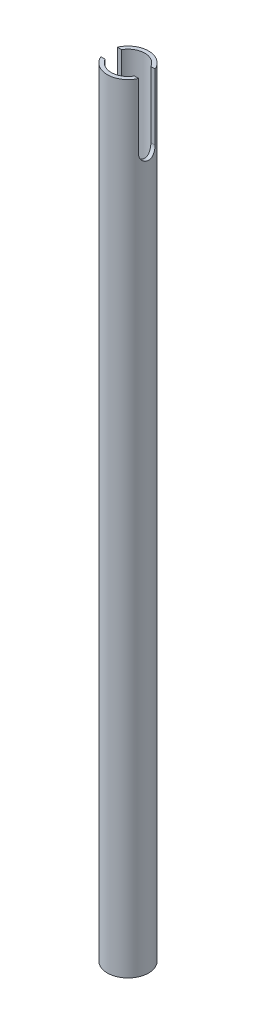
ISO-10303-21;
HEADER;
FILE_DESCRIPTION(('STEP AP214'),'2;1');
FILE_NAME('part.step','',(''),(''),'','','');
FILE_SCHEMA(('AUTOMOTIVE_DESIGN { 1 0 10303 214 1 1 1 1 }'));
ENDSEC;
DATA;
#1=APPLICATION_CONTEXT('core data for automotive mechanical design processes');
#2=APPLICATION_PROTOCOL_DEFINITION('international standard','automotive_design',2000,#1);
#3=PRODUCT_CONTEXT('',#1,'mechanical');
#4=PRODUCT('Part','Part','',(#3));
#5=PRODUCT_RELATED_PRODUCT_CATEGORY('part','',(#4));
#6=PRODUCT_DEFINITION_FORMATION('','',#4);
#7=PRODUCT_DEFINITION_CONTEXT('part definition',#1,'design');
#8=PRODUCT_DEFINITION('design','',#6,#7);
#9=PRODUCT_DEFINITION_SHAPE('','',#8);
#10=(LENGTH_UNIT() NAMED_UNIT(*) SI_UNIT(.MILLI.,.METRE.));
#11=(NAMED_UNIT(*) PLANE_ANGLE_UNIT() SI_UNIT($,.RADIAN.));
#12=(NAMED_UNIT(*) SI_UNIT($,.STERADIAN.) SOLID_ANGLE_UNIT());
#13=UNCERTAINTY_MEASURE_WITH_UNIT(LENGTH_MEASURE(1.E-05),#10,'distance_accuracy_value','');
#14=(GEOMETRIC_REPRESENTATION_CONTEXT(3) GLOBAL_UNCERTAINTY_ASSIGNED_CONTEXT((#13)) GLOBAL_UNIT_ASSIGNED_CONTEXT((#10,
#11,#12)) REPRESENTATION_CONTEXT('',''));
#15=CARTESIAN_POINT('',(0.,0.,0.));
#16=DIRECTION('',(0.,0.,1.));
#17=DIRECTION('',(1.,0.,0.));
#18=AXIS2_PLACEMENT_3D('',#15,#16,#17);
#19=CARTESIAN_POINT('',(0.,347.675648343785,0.));
#20=DIRECTION('',(0.,-1.,0.));
#21=DIRECTION('',(0.,0.,-1.));
#22=AXIS2_PLACEMENT_3D('',#19,#20,#21);
#23=CYLINDRICAL_SURFACE('',#22,7.9375);
#24=CARTESIAN_POINT('',(0.,0.,0.));
#25=DIRECTION('',(0.,1.,0.));
#26=DIRECTION('',(0.,0.,1.));
#27=AXIS2_PLACEMENT_3D('',#24,#25,#26);
#28=CIRCLE('',#27,7.9375);
#29=CARTESIAN_POINT('',(0.,0.,7.9375));
#30=VERTEX_POINT('',#29);
#31=EDGE_CURVE('E197',#30,#30,#28,.T.);
#32=ORIENTED_EDGE('',*,*,#31,.T.);
#33=EDGE_LOOP('',(#32));
#34=FACE_BOUND('',#33,.T.);
#35=DIRECTION('',(0.,-1.,0.));
#36=VECTOR('',#35,1.);
#37=CARTESIAN_POINT('',(-7.2748389157424,347.675648343785,3.175));
#38=LINE('',#37,#36);
#39=CARTESIAN_POINT('',(-7.27483891574239,274.425008041112,3.175));
#40=VERTEX_POINT('',#39);
#41=CARTESIAN_POINT('',(-7.27483891574239,299.825008041112,3.175));
#42=VERTEX_POINT('',#41);
#43=EDGE_CURVE('E143',#40,#42,#38,.F.);
#44=ORIENTED_EDGE('',*,*,#43,.F.);
#45=CARTESIAN_POINT('',(-7.27483891574239,274.425008041112,-3.175));
#46=CARTESIAN_POINT('',(-7.2748213734673,274.339591250264,-3.17501266882702));
#47=CARTESIAN_POINT('',(-7.2763428589775,274.254184047039,-3.17155340043565));
#48=CARTESIAN_POINT('',(-7.2823328035035,274.084058605132,-3.15779000732847));
#49=CARTESIAN_POINT('',(-7.28680014012065,273.999340116484,-3.14748848956709));
#50=CARTESIAN_POINT('',(-7.29852780386515,273.831526211887,-3.12019320836238));
#51=CARTESIAN_POINT('',(-7.30577708764083,273.748425726442,-3.10322589952439));
#52=CARTESIAN_POINT('',(-7.32282084608483,273.584108066015,-3.06278962927675));
#53=CARTESIAN_POINT('',(-7.3326154761132,273.502891006322,-3.03932027099635));
#54=CARTESIAN_POINT('',(-7.36535374856867,273.263059878313,-2.95952817722213));
#55=CARTESIAN_POINT('',(-7.39167700537415,273.107931949893,-2.89376627017735));
#56=CARTESIAN_POINT('',(-7.45033388590045,272.810845057729,-2.73920254152611));
#57=CARTESIAN_POINT('',(-7.48267321509131,272.66889878828,-2.65037881684982));
#58=CARTESIAN_POINT('',(-7.55175336550834,272.394178986397,-2.4468428923214));
#59=CARTESIAN_POINT('',(-7.58863489946299,272.262250084272,-2.33103600963011));
#60=CARTESIAN_POINT('',(-7.66147804996073,272.019087858956,-2.07914313305183));
#61=CARTESIAN_POINT('',(-7.69743947634239,271.907858784533,-1.94305298619928));
#62=CARTESIAN_POINT('',(-7.76610424655587,271.704975390409,-1.64783437907488));
#63=CARTESIAN_POINT('',(-7.79862271461643,271.614268156722,-1.48800809365191));
#64=CARTESIAN_POINT('',(-7.85501261299655,271.461393075406,-1.15383332747063));
#65=CARTESIAN_POINT('',(-7.87888765130921,271.39921331676,-0.979490943577494));
#66=CARTESIAN_POINT('',(-7.91429574508624,271.308203885144,-0.630185812820628));
#67=CARTESIAN_POINT('',(-7.92637039529115,271.27790526061,-0.455661798193253));
#68=CARTESIAN_POINT('',(-7.93877492459936,271.246787825139,-0.103613634211555));
#69=CARTESIAN_POINT('',(-7.93910896442721,271.245958570626,0.0739094300030672));
#70=CARTESIAN_POINT('',(-7.92832361516669,271.272999562552,0.416295487790186));
#71=CARTESIAN_POINT('',(-7.91784651916131,271.299260354581,0.581309494992126));
#72=CARTESIAN_POINT('',(-7.88748217026596,271.376997554682,0.90435871255696));
#73=CARTESIAN_POINT('',(-7.86759438481231,271.428475389825,1.06239352740443));
#74=CARTESIAN_POINT('',(-7.81997467816327,271.55581835784,1.36984988491622));
#75=CARTESIAN_POINT('',(-7.7921290207194,271.632039447975,1.51910565802054));
#76=CARTESIAN_POINT('',(-7.73135683541739,271.806369838171,1.80309420082015));
#77=CARTESIAN_POINT('',(-7.69842852631223,271.904486817178,1.93782185081833));
#78=CARTESIAN_POINT('',(-7.62828318752464,272.127333611424,2.19831250886755));
#79=CARTESIAN_POINT('',(-7.59092651959626,272.253386753899,2.32290812422053));
#80=CARTESIAN_POINT('',(-7.51779639956166,272.524727652491,2.5496801795791));
#81=CARTESIAN_POINT('',(-7.48202367463434,272.670024123407,2.6518464058569));
#82=CARTESIAN_POINT('',(-7.41514238501918,272.981173063146,2.83359604410577));
#83=CARTESIAN_POINT('',(-7.38419755733311,273.147496554611,2.9124454400729));
#84=CARTESIAN_POINT('',(-7.34535742834898,273.406037427998,3.00845526999255));
#85=CARTESIAN_POINT('',(-7.33367552004289,273.493704236221,3.03674359852998));
#86=CARTESIAN_POINT('',(-7.31322917691504,273.671469950935,3.08565852812916));
#87=CARTESIAN_POINT('',(-7.30446343423192,273.761567747505,3.10628856431505));
#88=CARTESIAN_POINT('',(-7.28994070197193,273.946732199543,3.14023004946565));
#89=CARTESIAN_POINT('',(-7.2843027635288,274.041861225068,3.15325280299648));
#90=CARTESIAN_POINT('',(-7.27673901487912,274.232991799659,3.17064531592314));
#91=CARTESIAN_POINT('',(-7.2748109173123,274.328992774399,3.17502040721544));
#92=CARTESIAN_POINT('',(-7.2748389157424,274.425008041112,3.175));
#93=B_SPLINE_CURVE_WITH_KNOTS('',3,(#45,#46,#47,#48,#49,#50,#51,#52,#53,#54,#55,#56,#57,#58,#59,
#60,#61,#62,#63,#64,#65,#66,#67,#68,#69,#70,#71,#72,#73,#74,#75,#76,#77,#78,#79,#80,#81,#82,#83,
#84,#85,#86,#87,#88,#89,#90,#91,#92),.UNSPECIFIED.,.F.,.F.,(4,2,2,2,2,2,2,2,2,2,2,2,2,2,2,2,2,2,
2,2,2,2,2,4),(0.,0.256150829294387,0.512204118914552,0.767251309112325,1.02231407025902,
1.53143426526075,2.04103977971416,2.57679901192849,3.11266809105968,3.6697103854465,
4.22651988700748,4.75637028950526,5.28603291779514,5.7859440297451,6.28588343572724,
6.79335980872481,7.30101443548666,7.8419622604596,8.383155909604,8.93991483457339,
9.21815697205885,9.49627415290111,9.78435582473146,10.072259818324),.UNSPECIFIED.);
#94=CARTESIAN_POINT('',(-7.27483891574239,274.425008041112,-3.175));
#95=VERTEX_POINT('',#94);
#96=EDGE_CURVE('E118',#95,#40,#93,.T.);
#97=ORIENTED_EDGE('',*,*,#96,.F.);
#98=DIRECTION('',(0.,-1.,0.));
#99=VECTOR('',#98,1.);
#100=CARTESIAN_POINT('',(-7.2748389157424,347.675648343785,-3.17499999999999));
#101=LINE('',#100,#99);
#102=CARTESIAN_POINT('',(-7.27483891574239,299.825008041112,-3.175));
#103=VERTEX_POINT('',#102);
#104=EDGE_CURVE('E131',#103,#95,#101,.T.);
#105=ORIENTED_EDGE('',*,*,#104,.F.);
#106=CARTESIAN_POINT('',(0.,299.825008041112,0.));
#107=DIRECTION('',(0.,1.,0.));
#108=DIRECTION('',(-1.,0.,0.));
#109=AXIS2_PLACEMENT_3D('',#106,#107,#108);
#110=CIRCLE('',#109,7.9375);
#111=CARTESIAN_POINT('',(7.2748389157424,299.825008041112,-3.175));
#112=VERTEX_POINT('',#111);
#113=EDGE_CURVE('E130',#112,#103,#110,.T.);
#114=ORIENTED_EDGE('',*,*,#113,.F.);
#115=DIRECTION('',(0.,-1.,0.));
#116=VECTOR('',#115,1.);
#117=CARTESIAN_POINT('',(7.2748389157424,347.675648343785,-3.17499999999999));
#118=LINE('',#117,#116);
#119=CARTESIAN_POINT('',(7.2748389157424,274.425008041112,-3.175));
#120=VERTEX_POINT('',#119);
#121=EDGE_CURVE('E56',#120,#112,#118,.F.);
#122=ORIENTED_EDGE('',*,*,#121,.F.);
#123=CARTESIAN_POINT('',(7.2748389157424,274.425008041112,3.175));
#124=CARTESIAN_POINT('',(7.2748213734673,274.339591250264,3.17501266882701));
#125=CARTESIAN_POINT('',(7.2763428589775,274.254184047039,3.17155340043564));
#126=CARTESIAN_POINT('',(7.2823328035035,274.084058605132,3.15779000732846));
#127=CARTESIAN_POINT('',(7.28680014012065,273.999340116484,3.14748848956708));
#128=CARTESIAN_POINT('',(7.29852780386515,273.831526211887,3.12019320836237));
#129=CARTESIAN_POINT('',(7.30577708764083,273.748425726442,3.10322589952439));
#130=CARTESIAN_POINT('',(7.32282084608483,273.584108066015,3.06278962927675));
#131=CARTESIAN_POINT('',(7.3326154761132,273.502891006322,3.03932027099634));
#132=CARTESIAN_POINT('',(7.36535374856867,273.263059878313,2.95952817722213));
#133=CARTESIAN_POINT('',(7.39167700537415,273.107931949893,2.89376627017734));
#134=CARTESIAN_POINT('',(7.45033388590046,272.810845057729,2.7392025415261));
#135=CARTESIAN_POINT('',(7.48267321509131,272.66889878828,2.65037881684982));
#136=CARTESIAN_POINT('',(7.55175336550835,272.394178986397,2.4468428923214));
#137=CARTESIAN_POINT('',(7.588634899463,272.262250084272,2.3310360096301));
#138=CARTESIAN_POINT('',(7.66147804996073,272.019087858956,2.07914313305183));
#139=CARTESIAN_POINT('',(7.69743947634238,271.907858784533,1.94305298619927));
#140=CARTESIAN_POINT('',(7.76610424655587,271.704975390409,1.64783437907488));
#141=CARTESIAN_POINT('',(7.79862271461643,271.614268156722,1.48800809365191));
#142=CARTESIAN_POINT('',(7.85501261299655,271.461393075406,1.15383332747062));
#143=CARTESIAN_POINT('',(7.87888765130921,271.39921331676,0.97949094357749));
#144=CARTESIAN_POINT('',(7.91429574508624,271.308203885144,0.630185812820622));
#145=CARTESIAN_POINT('',(7.92637039529115,271.27790526061,0.455661798193245));
#146=CARTESIAN_POINT('',(7.93877492459936,271.246787825139,0.103613634211547));
#147=CARTESIAN_POINT('',(7.93910896442721,271.245958570626,-0.0739094300030729));
#148=CARTESIAN_POINT('',(7.92832361516669,271.272999562552,-0.416295487790189));
#149=CARTESIAN_POINT('',(7.91784651916131,271.299260354581,-0.581309494992129));
#150=CARTESIAN_POINT('',(7.88748217026596,271.376997554682,-0.904358712556963));
#151=CARTESIAN_POINT('',(7.86759438481231,271.428475389825,-1.06239352740444));
#152=CARTESIAN_POINT('',(7.81997467816327,271.55581835784,-1.36984988491622));
#153=CARTESIAN_POINT('',(7.7921290207194,271.632039447975,-1.51910565802055));
#154=CARTESIAN_POINT('',(7.73135683541739,271.806369838171,-1.80309420082015));
#155=CARTESIAN_POINT('',(7.69842852631223,271.904486817178,-1.93782185081833));
#156=CARTESIAN_POINT('',(7.62828318752464,272.127333611424,-2.19831250886756));
#157=CARTESIAN_POINT('',(7.59092651959626,272.253386753899,-2.32290812422054));
#158=CARTESIAN_POINT('',(7.51779639956165,272.524727652491,-2.54968017957911));
#159=CARTESIAN_POINT('',(7.48202367463434,272.670024123407,-2.65184640585691));
#160=CARTESIAN_POINT('',(7.41514238501918,272.981173063146,-2.83359604410578));
#161=CARTESIAN_POINT('',(7.38419755733311,273.147496554611,-2.91244544007291));
#162=CARTESIAN_POINT('',(7.34535742834898,273.406037427998,-3.00845526999255));
#163=CARTESIAN_POINT('',(7.3336755200429,273.493704236221,-3.03674359852997));
#164=CARTESIAN_POINT('',(7.31322917691504,273.671469950935,-3.08565852812915));
#165=CARTESIAN_POINT('',(7.30446343423192,273.761567747505,-3.10628856431505));
#166=CARTESIAN_POINT('',(7.28994070197193,273.946732199543,-3.14023004946565));
#167=CARTESIAN_POINT('',(7.2843027635288,274.041861225068,-3.15325280299648));
#168=CARTESIAN_POINT('',(7.27673901487912,274.232991799659,-3.17064531592315));
#169=CARTESIAN_POINT('',(7.2748109173123,274.328992774399,-3.17502040721544));
#170=CARTESIAN_POINT('',(7.27483891574239,274.425008041112,-3.175));
#171=B_SPLINE_CURVE_WITH_KNOTS('',3,(#123,#124,#125,#126,#127,#128,#129,#130,#131,#132,#133,
#134,#135,#136,#137,#138,#139,#140,#141,#142,#143,#144,#145,#146,#147,#148,#149,#150,#151,#152,
#153,#154,#155,#156,#157,#158,#159,#160,#161,#162,#163,#164,#165,#166,#167,#168,#169,#170),
.UNSPECIFIED.,.F.,.F.,(4,2,2,2,2,2,2,2,2,2,2,2,2,2,2,2,2,2,2,2,2,2,2,4),(0.,0.256150829294386,
0.512204118914552,0.767251309112325,1.02231407025902,1.53143426526075,2.04103977971416,
2.57679901192849,3.11266809105968,3.6697103854465,4.22651988700748,4.75637028950527,
5.28603291779514,5.7859440297451,6.28588343572724,6.79335980872481,7.30101443548666,
7.8419622604596,8.383155909604,8.9399148345734,9.21815697205879,9.49627415290111,
9.78435582473147,10.072259818324),.UNSPECIFIED.);
#172=CARTESIAN_POINT('',(7.2748389157424,274.425008041112,3.175));
#173=VERTEX_POINT('',#172);
#174=EDGE_CURVE('E109',#173,#120,#171,.T.);
#175=ORIENTED_EDGE('',*,*,#174,.F.);
#176=DIRECTION('',(0.,-1.,0.));
#177=VECTOR('',#176,1.);
#178=CARTESIAN_POINT('',(7.2748389157424,347.675648343785,3.175));
#179=LINE('',#178,#177);
#180=CARTESIAN_POINT('',(7.2748389157424,299.825008041112,3.175));
#181=VERTEX_POINT('',#180);
#182=EDGE_CURVE('E145',#181,#173,#179,.T.);
#183=ORIENTED_EDGE('',*,*,#182,.F.);
#184=EDGE_CURVE('E200',#42,#181,#110,.T.);
#185=ORIENTED_EDGE('',*,*,#184,.F.);
#186=EDGE_LOOP('',(#44,#97,#105,#114,#122,#175,#183,#185));
#187=FACE_BOUND('',#186,.T.);
#188=ADVANCED_FACE('F35',(#34,#187),#23,.T.);
#189=CARTESIAN_POINT('',(0.,347.675648343785,0.));
#190=DIRECTION('',(0.,-1.,0.));
#191=DIRECTION('',(0.,0.,-1.));
#192=AXIS2_PLACEMENT_3D('',#189,#190,#191);
#193=CYLINDRICAL_SURFACE('',#192,6.4643);
#194=CARTESIAN_POINT('',(0.,0.,0.));
#195=DIRECTION('',(0.,1.,0.));
#196=DIRECTION('',(0.,0.,1.));
#197=AXIS2_PLACEMENT_3D('',#194,#195,#196);
#198=CIRCLE('',#197,6.4643);
#199=CARTESIAN_POINT('',(0.,0.,6.4643));
#200=VERTEX_POINT('',#199);
#201=EDGE_CURVE('E198',#200,#200,#198,.T.);
#202=ORIENTED_EDGE('',*,*,#201,.F.);
#203=EDGE_LOOP('',(#202));
#204=FACE_BOUND('',#203,.T.);
#205=CARTESIAN_POINT('',(-5.63085690548072,274.425008041112,-3.175));
#206=CARTESIAN_POINT('',(-5.63083314427865,274.341634696481,-3.17501475658537));
#207=CARTESIAN_POINT('',(-5.63270800290612,274.258274512389,-3.17171650894933));
#208=CARTESIAN_POINT('',(-5.64007619078876,274.092276252269,-3.15861005673363));
#209=CARTESIAN_POINT('',(-5.64556738634361,274.009637779534,-3.14880569084844));
#210=CARTESIAN_POINT('',(-5.65994981136478,273.846134290514,-3.12287502503969));
#211=CARTESIAN_POINT('',(-5.66882198481541,273.765261972891,-3.10678414485084));
#212=CARTESIAN_POINT('',(-5.68964152520502,273.605397716108,-3.06848950606603));
#213=CARTESIAN_POINT('',(-5.70158922758274,273.526405983084,-3.0462850806656));
#214=CARTESIAN_POINT('',(-5.74141923049072,273.293341184853,-2.97094683956399));
#215=CARTESIAN_POINT('',(-5.77333408209964,273.14270155547,-2.9090108202004));
#216=CARTESIAN_POINT('',(-5.84425924105451,272.853846986411,-2.76375069900003));
#217=CARTESIAN_POINT('',(-5.8832801090714,272.715651003018,-2.68039468681891));
#218=CARTESIAN_POINT('',(-5.96775511660967,272.443710225543,-2.48697633404428));
#219=CARTESIAN_POINT('',(-6.01347388807208,272.311173191009,-2.37532770540397));
#220=CARTESIAN_POINT('',(-6.10404750316967,272.065798433798,-2.13181920715592));
#221=CARTESIAN_POINT('',(-6.1489021156932,271.952965917599,-1.99995401300493));
#222=CARTESIAN_POINT('',(-6.23617179606458,271.743032841317,-1.70932187954953));
#223=CARTESIAN_POINT('',(-6.27824209999684,271.647419374315,-1.54936740140361));
#224=CARTESIAN_POINT('',(-6.35176072116115,271.485012142257,-1.21319061658815));
#225=CARTESIAN_POINT('',(-6.38321544776103,271.418200980447,-1.03697820811138));
#226=CARTESIAN_POINT('',(-6.43004158193837,271.320074935064,-0.686188092188346));
#227=CARTESIAN_POINT('',(-6.4463738522475,271.286626950148,-0.512338218857009));
#228=CARTESIAN_POINT('',(-6.46469144763397,271.249166361634,-0.160782019690511));
#229=CARTESIAN_POINT('',(-6.46668486855406,271.245137147916,0.0169220731568627));
#230=CARTESIAN_POINT('',(-6.45656772214049,271.265772945804,0.35516546469063));
#231=CARTESIAN_POINT('',(-6.44562758639317,271.288056556589,0.515892945153654));
#232=CARTESIAN_POINT('',(-6.41262380355029,271.356443362929,0.830980900255622));
#233=CARTESIAN_POINT('',(-6.39055953953696,271.402547879537,0.985341021262242));
#234=CARTESIAN_POINT('',(-6.33694807701977,271.517607122565,1.28605792480314));
#235=CARTESIAN_POINT('',(-6.30527071175889,271.586876923599,1.43226999332139));
#236=CARTESIAN_POINT('',(-6.23531544865734,271.745884109403,1.71135796541493));
#237=CARTESIAN_POINT('',(-6.19703506227319,271.835629215026,1.844228810978));
#238=CARTESIAN_POINT('',(-6.11334024943196,272.04254511211,2.10589815284401));
#239=CARTESIAN_POINT('',(-6.06759349912715,272.161479148331,2.23319819913489));
#240=CARTESIAN_POINT('',(-5.97642079952694,272.418632659765,2.46684622430579));
#241=CARTESIAN_POINT('',(-5.93099515323759,272.556868311005,2.57317644688652));
#242=CARTESIAN_POINT('',(-5.84266284464015,272.859071138522,2.76814528378424));
#243=CARTESIAN_POINT('',(-5.80007313328348,273.024087157575,2.85533090866607));
#244=CARTESIAN_POINT('',(-5.74498523796176,273.28246397602,2.96377401450739));
#245=CARTESIAN_POINT('',(-5.72809486991883,273.370352463979,2.99618869442096));
#246=CARTESIAN_POINT('',(-5.69788122082071,273.549189150563,3.0532549442109));
#247=CARTESIAN_POINT('',(-5.68455638707004,273.640135997868,3.07790989407046));
#248=CARTESIAN_POINT('',(-5.65951648210793,273.845253433852,3.12376274190011));
#249=CARTESIAN_POINT('',(-5.64884707083827,273.960024399148,3.14291763203007));
#250=CARTESIAN_POINT('',(-5.63809564796983,274.133577505659,3.16213513069618));
#251=CARTESIAN_POINT('',(-5.63538722073203,274.191717379026,3.16695519983111));
#252=CARTESIAN_POINT('',(-5.63176603795252,274.308235010258,3.17338827752118));
#253=CARTESIAN_POINT('',(-5.63085344341391,274.366612788982,3.17500099852574));
#254=CARTESIAN_POINT('',(-5.63085690548073,274.425008041112,3.175));
#255=B_SPLINE_CURVE_WITH_KNOTS('',3,(#205,#206,#207,#208,#209,#210,#211,#212,#213,#214,#215,
#216,#217,#218,#219,#220,#221,#222,#223,#224,#225,#226,#227,#228,#229,#230,#231,#232,#233,#234,
#235,#236,#237,#238,#239,#240,#241,#242,#243,#244,#245,#246,#247,#248,#249,#250,#251,#252,#253,
#254),.UNSPECIFIED.,.F.,.F.,(4,2,2,2,2,2,2,2,2,2,2,2,2,2,2,2,2,2,2,2,2,2,2,2,4),(0.,
0.250012145988174,0.499876912554559,0.748353725112793,0.996857649784888,1.4924278441344,
1.98874063593385,2.52414179614751,3.05968421079767,3.6298216154268,4.19961416973237,
4.73004882970632,5.26018397799674,5.74579693142525,6.23143681875924,6.72397049630928,
7.21669020692481,7.75472587709896,8.29321519372078,8.8641676370442,9.14936329782648,
9.43443456060701,9.78397951274085,9.95908597830923,10.1342081421097),.UNSPECIFIED.);
#256=CARTESIAN_POINT('',(-5.63085690548073,274.425008041112,-3.175));
#257=VERTEX_POINT('',#256);
#258=CARTESIAN_POINT('',(-5.63085690548073,274.425008041112,3.175));
#259=VERTEX_POINT('',#258);
#260=EDGE_CURVE('E12',#257,#259,#255,.T.);
#261=ORIENTED_EDGE('',*,*,#260,.T.);
#262=DIRECTION('',(0.,-1.,0.));
#263=VECTOR('',#262,1.);
#264=CARTESIAN_POINT('',(-5.63085690548073,347.675648343785,3.175));
#265=LINE('',#264,#263);
#266=CARTESIAN_POINT('',(-5.63085690548072,299.825008041112,3.175));
#267=VERTEX_POINT('',#266);
#268=EDGE_CURVE('E133',#259,#267,#265,.F.);
#269=ORIENTED_EDGE('',*,*,#268,.T.);
#270=CARTESIAN_POINT('',(0.,299.825008041112,0.));
#271=DIRECTION('',(0.,1.,0.));
#272=DIRECTION('',(-1.,0.,0.));
#273=AXIS2_PLACEMENT_3D('',#270,#271,#272);
#274=CIRCLE('',#273,6.4643);
#275=CARTESIAN_POINT('',(5.63085690548073,299.825008041112,3.175));
#276=VERTEX_POINT('',#275);
#277=EDGE_CURVE('E202',#267,#276,#274,.T.);
#278=ORIENTED_EDGE('',*,*,#277,.T.);
#279=DIRECTION('',(0.,-1.,0.));
#280=VECTOR('',#279,1.);
#281=CARTESIAN_POINT('',(5.63085690548073,347.675648343785,3.175));
#282=LINE('',#281,#280);
#283=CARTESIAN_POINT('',(5.63085690548073,274.425008041112,3.175));
#284=VERTEX_POINT('',#283);
#285=EDGE_CURVE('E140',#276,#284,#282,.T.);
#286=ORIENTED_EDGE('',*,*,#285,.T.);
#287=CARTESIAN_POINT('',(5.63085690548073,274.425008041112,3.175));
#288=CARTESIAN_POINT('',(5.63083314427865,274.341634696481,3.17501475658537));
#289=CARTESIAN_POINT('',(5.63270800290612,274.258274512389,3.17171650894932));
#290=CARTESIAN_POINT('',(5.64007619078876,274.092276252269,3.15861005673363));
#291=CARTESIAN_POINT('',(5.64556738634361,274.009637779534,3.14880569084843));
#292=CARTESIAN_POINT('',(5.65994981136478,273.846134290514,3.12287502503969));
#293=CARTESIAN_POINT('',(5.66882198481541,273.765261972891,3.10678414485083));
#294=CARTESIAN_POINT('',(5.68964152520502,273.605397716108,3.06848950606603));
#295=CARTESIAN_POINT('',(5.70158922758274,273.526405983084,3.0462850806656));
#296=CARTESIAN_POINT('',(5.74141923049072,273.293341184853,2.97094683956398));
#297=CARTESIAN_POINT('',(5.77333408209964,273.14270155547,2.9090108202004));
#298=CARTESIAN_POINT('',(5.84425924105452,272.853846986411,2.76375069900003));
#299=CARTESIAN_POINT('',(5.8832801090714,272.715651003018,2.6803946868189));
#300=CARTESIAN_POINT('',(5.96775511660967,272.443710225543,2.48697633404428));
#301=CARTESIAN_POINT('',(6.01347388807208,272.311173191009,2.37532770540396));
#302=CARTESIAN_POINT('',(6.10404750316967,272.065798433798,2.13181920715592));
#303=CARTESIAN_POINT('',(6.1489021156932,271.952965917599,1.99995401300493));
#304=CARTESIAN_POINT('',(6.23617179606458,271.743032841317,1.70932187954952));
#305=CARTESIAN_POINT('',(6.27824209999684,271.647419374315,1.54936740140359));
#306=CARTESIAN_POINT('',(6.35176072116115,271.485012142257,1.21319061658813));
#307=CARTESIAN_POINT('',(6.38321544776103,271.418200980447,1.03697820811136));
#308=CARTESIAN_POINT('',(6.43004158193837,271.320074935064,0.68618809218834));
#309=CARTESIAN_POINT('',(6.4463738522475,271.286626950148,0.512338218857003));
#310=CARTESIAN_POINT('',(6.46469144763397,271.249166361634,0.160782019690505));
#311=CARTESIAN_POINT('',(6.46668486855406,271.245137147916,-0.0169220731568686));
#312=CARTESIAN_POINT('',(6.45656772214049,271.265772945804,-0.355165464690635));
#313=CARTESIAN_POINT('',(6.44562758639317,271.288056556589,-0.515892945153659));
#314=CARTESIAN_POINT('',(6.41262380355029,271.356443362929,-0.830980900255626));
#315=CARTESIAN_POINT('',(6.39055953953696,271.402547879537,-0.985341021262246));
#316=CARTESIAN_POINT('',(6.33694807701977,271.517607122565,-1.28605792480315));
#317=CARTESIAN_POINT('',(6.30527071175889,271.586876923599,-1.4322699933214));
#318=CARTESIAN_POINT('',(6.23531544865734,271.745884109403,-1.71135796541494));
#319=CARTESIAN_POINT('',(6.19703506227319,271.835629215026,-1.84422881097801));
#320=CARTESIAN_POINT('',(6.11334024943196,272.04254511211,-2.10589815284401));
#321=CARTESIAN_POINT('',(6.06759349912715,272.161479148331,-2.23319819913489));
#322=CARTESIAN_POINT('',(5.97642079952693,272.418632659765,-2.46684622430579));
#323=CARTESIAN_POINT('',(5.93099515323759,272.556868311005,-2.57317644688653));
#324=CARTESIAN_POINT('',(5.84266284464015,272.859071138522,-2.76814528378425));
#325=CARTESIAN_POINT('',(5.80007313328348,273.024087157575,-2.85533090866607));
#326=CARTESIAN_POINT('',(5.74498523796176,273.28246397602,-2.9637740145074));
#327=CARTESIAN_POINT('',(5.72809486991883,273.370352463979,-2.99618869442096));
#328=CARTESIAN_POINT('',(5.69788122082071,273.549189150563,-3.0532549442109));
#329=CARTESIAN_POINT('',(5.68455638707004,273.640135997868,-3.07790989407046));
#330=CARTESIAN_POINT('',(5.65951648210793,273.845253433852,-3.12376274190011));
#331=CARTESIAN_POINT('',(5.64884707083826,273.960024399148,-3.14291763203007));
#332=CARTESIAN_POINT('',(5.63809564796982,274.133577505659,-3.16213513069618));
#333=CARTESIAN_POINT('',(5.63538722073202,274.191717379026,-3.16695519983112));
#334=CARTESIAN_POINT('',(5.63176603795252,274.308235010258,-3.17338827752118));
#335=CARTESIAN_POINT('',(5.63085344341391,274.366612788982,-3.17500099852574));
#336=CARTESIAN_POINT('',(5.63085690548073,274.425008041112,-3.175));
#337=B_SPLINE_CURVE_WITH_KNOTS('',3,(#287,#288,#289,#290,#291,#292,#293,#294,#295,#296,#297,
#298,#299,#300,#301,#302,#303,#304,#305,#306,#307,#308,#309,#310,#311,#312,#313,#314,#315,#316,
#317,#318,#319,#320,#321,#322,#323,#324,#325,#326,#327,#328,#329,#330,#331,#332,#333,#334,#335,
#336),.UNSPECIFIED.,.F.,.F.,(4,2,2,2,2,2,2,2,2,2,2,2,2,2,2,2,2,2,2,2,2,2,2,2,4),(0.,
0.250012145988174,0.499876912554559,0.748353725112793,0.996857649784888,1.4924278441344,
1.98874063593385,2.52414179614751,3.05968421079767,3.62982161542682,4.19961416973237,
4.73004882970632,5.26018397799674,5.74579693142524,6.23143681875924,6.72397049630928,
7.21669020692481,7.75472587709896,8.29321519372078,8.8641676370442,9.14936329782648,
9.43443456060701,9.78397951274085,9.95908597830923,10.1342081421097),.UNSPECIFIED.);
#338=CARTESIAN_POINT('',(5.63085690548073,274.425008041112,-3.175));
#339=VERTEX_POINT('',#338);
#340=EDGE_CURVE('E49',#284,#339,#337,.T.);
#341=ORIENTED_EDGE('',*,*,#340,.T.);
#342=DIRECTION('',(0.,-1.,0.));
#343=VECTOR('',#342,1.);
#344=CARTESIAN_POINT('',(5.63085690548073,347.675648343785,-3.17499999999999));
#345=LINE('',#344,#343);
#346=CARTESIAN_POINT('',(5.63085690548073,299.825008041112,-3.175));
#347=VERTEX_POINT('',#346);
#348=EDGE_CURVE('E122',#339,#347,#345,.F.);
#349=ORIENTED_EDGE('',*,*,#348,.T.);
#350=CARTESIAN_POINT('',(-5.63085690548073,299.825008041112,-3.175));
#351=VERTEX_POINT('',#350);
#352=EDGE_CURVE('E117',#347,#351,#274,.T.);
#353=ORIENTED_EDGE('',*,*,#352,.T.);
#354=DIRECTION('',(0.,-1.,0.));
#355=VECTOR('',#354,1.);
#356=CARTESIAN_POINT('',(-5.63085690548073,347.675648343785,-3.17499999999999));
#357=LINE('',#356,#355);
#358=EDGE_CURVE('E64',#351,#257,#357,.T.);
#359=ORIENTED_EDGE('',*,*,#358,.T.);
#360=EDGE_LOOP('',(#261,#269,#278,#286,#341,#349,#353,#359));
#361=FACE_BOUND('',#360,.T.);
#362=ADVANCED_FACE('F175',(#204,#361),#193,.F.);
#363=CARTESIAN_POINT('',(0.,299.825008041112,3.175));
#364=DIRECTION('',(0.,1.,0.));
#365=DIRECTION('',(-1.,0.,0.));
#366=AXIS2_PLACEMENT_3D('',#363,#364,#365);
#367=PLANE('',#366);
#368=ORIENTED_EDGE('',*,*,#184,.T.);
#369=DIRECTION('',(-1.,0.,0.));
#370=VECTOR('',#369,1.);
#371=CARTESIAN_POINT('',(0.,299.825008041112,3.175));
#372=LINE('',#371,#370);
#373=EDGE_CURVE('E172',#181,#276,#372,.T.);
#374=ORIENTED_EDGE('',*,*,#373,.T.);
#375=ORIENTED_EDGE('',*,*,#277,.F.);
#376=EDGE_CURVE('E173',#267,#42,#372,.T.);
#377=ORIENTED_EDGE('',*,*,#376,.T.);
#378=EDGE_LOOP('',(#368,#374,#375,#377));
#379=FACE_BOUND('',#378,.T.);
#380=ADVANCED_FACE('F178',(#379),#367,.T.);
#381=ORIENTED_EDGE('',*,*,#113,.T.);
#382=DIRECTION('',(1.,0.,0.));
#383=VECTOR('',#382,1.);
#384=CARTESIAN_POINT('',(0.,299.825008041112,-3.175));
#385=LINE('',#384,#383);
#386=EDGE_CURVE('E207',#103,#351,#385,.T.);
#387=ORIENTED_EDGE('',*,*,#386,.T.);
#388=ORIENTED_EDGE('',*,*,#352,.F.);
#389=EDGE_CURVE('E206',#347,#112,#385,.T.);
#390=ORIENTED_EDGE('',*,*,#389,.T.);
#391=EDGE_LOOP('',(#381,#387,#388,#390));
#392=FACE_BOUND('',#391,.T.);
#393=ADVANCED_FACE('F183',(#392),#367,.T.);
#394=CARTESIAN_POINT('',(0.,0.,0.));
#395=DIRECTION('',(0.,1.,0.));
#396=DIRECTION('',(0.,0.,1.));
#397=AXIS2_PLACEMENT_3D('',#394,#395,#396);
#398=PLANE('',#397);
#399=ORIENTED_EDGE('',*,*,#31,.F.);
#400=EDGE_LOOP('',(#399));
#401=FACE_BOUND('',#400,.T.);
#402=ORIENTED_EDGE('',*,*,#201,.T.);
#403=EDGE_LOOP('',(#402));
#404=FACE_BOUND('',#403,.T.);
#405=ADVANCED_FACE('F180',(#401,#404),#398,.F.);
#406=CARTESIAN_POINT('',(9.525,299.825008041112,-3.175));
#407=DIRECTION('',(0.,0.,1.));
#408=DIRECTION('',(0.,-1.,0.));
#409=AXIS2_PLACEMENT_3D('',#406,#407,#408);
#410=PLANE('',#409);
#411=ORIENTED_EDGE('',*,*,#121,.T.);
#412=ORIENTED_EDGE('',*,*,#389,.F.);
#413=ORIENTED_EDGE('',*,*,#348,.F.);
#414=DIRECTION('',(-1.,0.,0.));
#415=VECTOR('',#414,1.);
#416=CARTESIAN_POINT('',(9.525,274.425008041112,-3.175));
#417=LINE('',#416,#415);
#418=EDGE_CURVE('E111',#120,#339,#417,.T.);
#419=ORIENTED_EDGE('',*,*,#418,.F.);
#420=EDGE_LOOP('',(#411,#412,#413,#419));
#421=FACE_BOUND('',#420,.T.);
#422=ADVANCED_FACE('F120',(#421),#410,.T.);
#423=CARTESIAN_POINT('',(9.525,274.425008041112,3.175));
#424=DIRECTION('',(0.,0.,-1.));
#425=DIRECTION('',(-1.,0.,0.));
#426=AXIS2_PLACEMENT_3D('',#423,#424,#425);
#427=PLANE('',#426);
#428=ORIENTED_EDGE('',*,*,#182,.T.);
#429=DIRECTION('',(-1.,0.,0.));
#430=VECTOR('',#429,1.);
#431=CARTESIAN_POINT('',(9.525,274.425008041112,3.175));
#432=LINE('',#431,#430);
#433=EDGE_CURVE('E114',#173,#284,#432,.T.);
#434=ORIENTED_EDGE('',*,*,#433,.T.);
#435=ORIENTED_EDGE('',*,*,#285,.F.);
#436=ORIENTED_EDGE('',*,*,#373,.F.);
#437=EDGE_LOOP('',(#428,#434,#435,#436));
#438=FACE_BOUND('',#437,.T.);
#439=ADVANCED_FACE('F161',(#438),#427,.T.);
#440=CARTESIAN_POINT('',(9.525,274.425008041112,0.));
#441=DIRECTION('',(-1.,0.,0.));
#442=DIRECTION('',(0.,0.,1.));
#443=AXIS2_PLACEMENT_3D('',#440,#441,#442);
#444=CYLINDRICAL_SURFACE('',#443,3.175);
#445=ORIENTED_EDGE('',*,*,#174,.T.);
#446=ORIENTED_EDGE('',*,*,#418,.T.);
#447=ORIENTED_EDGE('',*,*,#340,.F.);
#448=ORIENTED_EDGE('',*,*,#433,.F.);
#449=EDGE_LOOP('',(#445,#446,#447,#448));
#450=FACE_BOUND('',#449,.T.);
#451=ADVANCED_FACE('F110',(#450),#444,.F.);
#452=ORIENTED_EDGE('',*,*,#96,.T.);
#453=EDGE_CURVE('E123',#259,#40,#432,.T.);
#454=ORIENTED_EDGE('',*,*,#453,.F.);
#455=ORIENTED_EDGE('',*,*,#260,.F.);
#456=EDGE_CURVE('E124',#257,#95,#417,.T.);
#457=ORIENTED_EDGE('',*,*,#456,.T.);
#458=EDGE_LOOP('',(#452,#454,#455,#457));
#459=FACE_BOUND('',#458,.T.);
#460=ADVANCED_FACE('F160',(#459),#444,.F.);
#461=ORIENTED_EDGE('',*,*,#43,.T.);
#462=ORIENTED_EDGE('',*,*,#376,.F.);
#463=ORIENTED_EDGE('',*,*,#268,.F.);
#464=ORIENTED_EDGE('',*,*,#453,.T.);
#465=EDGE_LOOP('',(#461,#462,#463,#464));
#466=FACE_BOUND('',#465,.T.);
#467=ADVANCED_FACE('F221',(#466),#427,.T.);
#468=ORIENTED_EDGE('',*,*,#104,.T.);
#469=ORIENTED_EDGE('',*,*,#456,.F.);
#470=ORIENTED_EDGE('',*,*,#358,.F.);
#471=ORIENTED_EDGE('',*,*,#386,.F.);
#472=EDGE_LOOP('',(#468,#469,#470,#471));
#473=FACE_BOUND('',#472,.T.);
#474=ADVANCED_FACE('F162',(#473),#410,.T.);
#475=CLOSED_SHELL('',(#188,#362,#380,#393,#405,#422,#439,#451,#460,#467,#474));
#476=MANIFOLD_SOLID_BREP('B2',#475);
#477=ADVANCED_BREP_SHAPE_REPRESENTATION('',(#18,#476),#14);
#478=SHAPE_DEFINITION_REPRESENTATION(#9,#477);
ENDSEC;
END-ISO-10303-21;
